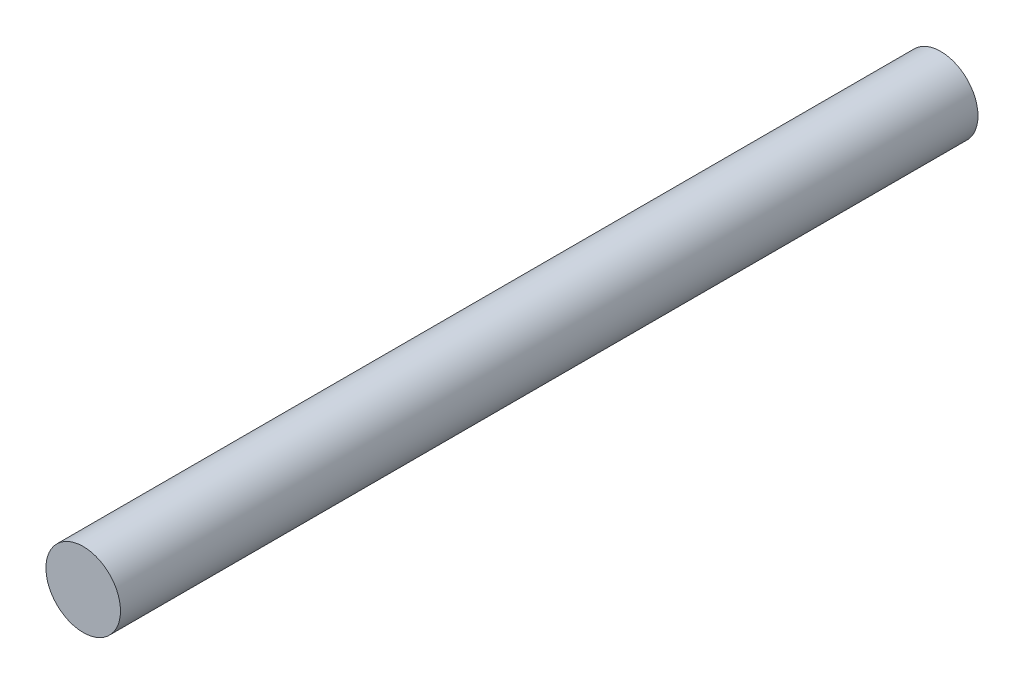
ISO-10303-21;
HEADER;
FILE_DESCRIPTION(('STEP AP214'),'2;1');
FILE_NAME('part.step','',(''),(''),'','','');
FILE_SCHEMA(('AUTOMOTIVE_DESIGN { 1 0 10303 214 1 1 1 1 }'));
ENDSEC;
DATA;
#1=APPLICATION_CONTEXT('core data for automotive mechanical design processes');
#2=APPLICATION_PROTOCOL_DEFINITION('international standard','automotive_design',2000,#1);
#3=PRODUCT_CONTEXT('',#1,'mechanical');
#4=PRODUCT('Part','Part','',(#3));
#5=PRODUCT_RELATED_PRODUCT_CATEGORY('part','',(#4));
#6=PRODUCT_DEFINITION_FORMATION('','',#4);
#7=PRODUCT_DEFINITION_CONTEXT('part definition',#1,'design');
#8=PRODUCT_DEFINITION('design','',#6,#7);
#9=PRODUCT_DEFINITION_SHAPE('','',#8);
#10=(LENGTH_UNIT() NAMED_UNIT(*) SI_UNIT(.MILLI.,.METRE.));
#11=(NAMED_UNIT(*) PLANE_ANGLE_UNIT() SI_UNIT($,.RADIAN.));
#12=(NAMED_UNIT(*) SI_UNIT($,.STERADIAN.) SOLID_ANGLE_UNIT());
#13=UNCERTAINTY_MEASURE_WITH_UNIT(LENGTH_MEASURE(1.E-05),#10,'distance_accuracy_value','');
#14=(GEOMETRIC_REPRESENTATION_CONTEXT(3) GLOBAL_UNCERTAINTY_ASSIGNED_CONTEXT((#13)) GLOBAL_UNIT_ASSIGNED_CONTEXT((#10,
#11,#12)) REPRESENTATION_CONTEXT('',''));
#15=CARTESIAN_POINT('',(0.,0.,0.));
#16=DIRECTION('',(0.,0.,1.));
#17=DIRECTION('',(1.,0.,0.));
#18=AXIS2_PLACEMENT_3D('',#15,#16,#17);
#19=CARTESIAN_POINT('',(0.,0.,292.1));
#20=DIRECTION('',(0.,0.,-1.));
#21=DIRECTION('',(-1.,0.,0.));
#22=AXIS2_PLACEMENT_3D('',#19,#20,#21);
#23=CYLINDRICAL_SURFACE('',#22,12.7);
#24=CARTESIAN_POINT('',(0.,0.,292.1));
#25=DIRECTION('',(0.,0.,1.));
#26=DIRECTION('',(1.,0.,0.));
#27=AXIS2_PLACEMENT_3D('',#24,#25,#26);
#28=CIRCLE('',#27,12.7);
#29=CARTESIAN_POINT('',(12.7,0.,292.1));
#30=VERTEX_POINT('',#29);
#31=EDGE_CURVE('E10',#30,#30,#28,.T.);
#32=ORIENTED_EDGE('',*,*,#31,.F.);
#33=EDGE_LOOP('',(#32));
#34=FACE_BOUND('',#33,.T.);
#35=CARTESIAN_POINT('',(0.,0.,0.));
#36=DIRECTION('',(0.,0.,1.));
#37=DIRECTION('',(1.,0.,0.));
#38=AXIS2_PLACEMENT_3D('',#35,#36,#37);
#39=CIRCLE('',#38,12.7);
#40=CARTESIAN_POINT('',(12.7,0.,0.));
#41=VERTEX_POINT('',#40);
#42=EDGE_CURVE('E44',#41,#41,#39,.T.);
#43=ORIENTED_EDGE('',*,*,#42,.T.);
#44=EDGE_LOOP('',(#43));
#45=FACE_BOUND('',#44,.T.);
#46=ADVANCED_FACE('F41',(#34,#45),#23,.T.);
#47=CARTESIAN_POINT('',(0.,0.,292.1));
#48=DIRECTION('',(0.,0.,1.));
#49=DIRECTION('',(1.,0.,0.));
#50=AXIS2_PLACEMENT_3D('',#47,#48,#49);
#51=PLANE('',#50);
#52=ORIENTED_EDGE('',*,*,#31,.T.);
#53=EDGE_LOOP('',(#52));
#54=FACE_BOUND('',#53,.T.);
#55=ADVANCED_FACE('F58',(#54),#51,.T.);
#56=CARTESIAN_POINT('',(0.,0.,0.));
#57=DIRECTION('',(0.,0.,1.));
#58=DIRECTION('',(1.,0.,0.));
#59=AXIS2_PLACEMENT_3D('',#56,#57,#58);
#60=PLANE('',#59);
#61=ORIENTED_EDGE('',*,*,#42,.F.);
#62=EDGE_LOOP('',(#61));
#63=FACE_BOUND('',#62,.T.);
#64=ADVANCED_FACE('F56',(#63),#60,.F.);
#65=CLOSED_SHELL('',(#46,#55,#64));
#66=MANIFOLD_SOLID_BREP('B2',#65);
#67=ADVANCED_BREP_SHAPE_REPRESENTATION('',(#18,#66),#14);
#68=SHAPE_DEFINITION_REPRESENTATION(#9,#67);
ENDSEC;
END-ISO-10303-21;
